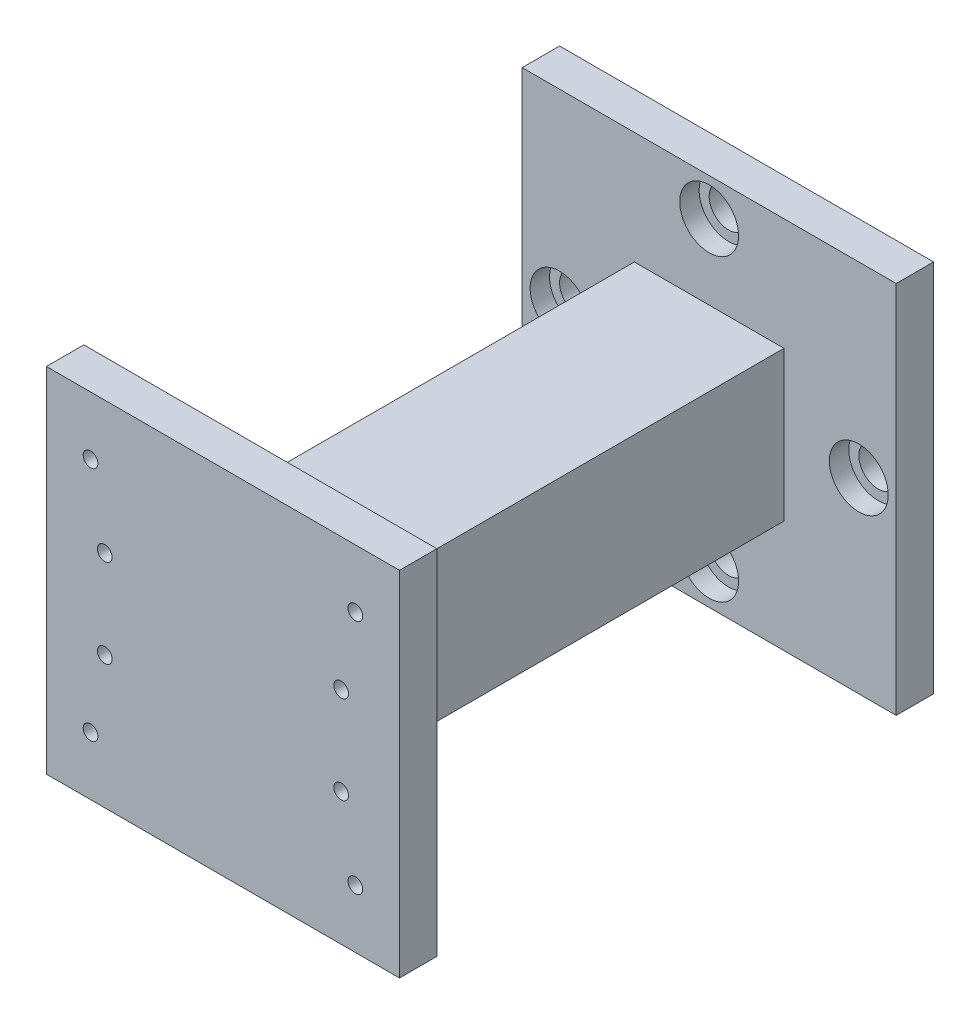
ISO-10303-21;
HEADER;
FILE_DESCRIPTION(('STEP AP214'),'2;1');
FILE_NAME('part.step','',(''),(''),'','','');
FILE_SCHEMA(('AUTOMOTIVE_DESIGN { 1 0 10303 214 1 1 1 1 }'));
ENDSEC;
DATA;
#1=APPLICATION_CONTEXT('core data for automotive mechanical design processes');
#2=APPLICATION_PROTOCOL_DEFINITION('international standard','automotive_design',2000,#1);
#3=PRODUCT_CONTEXT('',#1,'mechanical');
#4=PRODUCT('Part','Part','',(#3));
#5=PRODUCT_RELATED_PRODUCT_CATEGORY('part','',(#4));
#6=PRODUCT_DEFINITION_FORMATION('','',#4);
#7=PRODUCT_DEFINITION_CONTEXT('part definition',#1,'design');
#8=PRODUCT_DEFINITION('design','',#6,#7);
#9=PRODUCT_DEFINITION_SHAPE('','',#8);
#10=(LENGTH_UNIT() NAMED_UNIT(*) SI_UNIT(.MILLI.,.METRE.));
#11=(NAMED_UNIT(*) PLANE_ANGLE_UNIT() SI_UNIT($,.RADIAN.));
#12=(NAMED_UNIT(*) SI_UNIT($,.STERADIAN.) SOLID_ANGLE_UNIT());
#13=UNCERTAINTY_MEASURE_WITH_UNIT(LENGTH_MEASURE(1.E-05),#10,'distance_accuracy_value','');
#14=(GEOMETRIC_REPRESENTATION_CONTEXT(3) GLOBAL_UNCERTAINTY_ASSIGNED_CONTEXT((#13)) GLOBAL_UNIT_ASSIGNED_CONTEXT((#10,
#11,#12)) REPRESENTATION_CONTEXT('',''));
#15=CARTESIAN_POINT('',(0.,0.,0.));
#16=DIRECTION('',(0.,0.,1.));
#17=DIRECTION('',(1.,0.,0.));
#18=AXIS2_PLACEMENT_3D('',#15,#16,#17);
#19=CARTESIAN_POINT('',(0.,63.5,6.35));
#20=DIRECTION('',(1.,0.,0.));
#21=DIRECTION('',(0.,0.,-1.));
#22=AXIS2_PLACEMENT_3D('',#19,#20,#21);
#23=PLANE('',#22);
#24=DIRECTION('',(0.,-1.,0.));
#25=VECTOR('',#24,1.);
#26=CARTESIAN_POINT('',(0.,63.5,0.));
#27=LINE('',#26,#25);
#28=CARTESIAN_POINT('',(0.,63.5,0.));
#29=VERTEX_POINT('',#28);
#30=CARTESIAN_POINT('',(0.,0.,0.));
#31=VERTEX_POINT('',#30);
#32=EDGE_CURVE('E209',#29,#31,#27,.T.);
#33=ORIENTED_EDGE('',*,*,#32,.T.);
#34=DIRECTION('',(0.,0.,-1.));
#35=VECTOR('',#34,1.);
#36=CARTESIAN_POINT('',(0.,0.,6.35));
#37=LINE('',#36,#35);
#38=CARTESIAN_POINT('',(0.,0.,6.35));
#39=VERTEX_POINT('',#38);
#40=EDGE_CURVE('E11',#39,#31,#37,.T.);
#41=ORIENTED_EDGE('',*,*,#40,.F.);
#42=DIRECTION('',(0.,-1.,0.));
#43=VECTOR('',#42,1.);
#44=CARTESIAN_POINT('',(0.,63.5,6.35));
#45=LINE('',#44,#43);
#46=CARTESIAN_POINT('',(0.,63.5,6.35));
#47=VERTEX_POINT('',#46);
#48=EDGE_CURVE('E210',#47,#39,#45,.T.);
#49=ORIENTED_EDGE('',*,*,#48,.F.);
#50=DIRECTION('',(0.,0.,-1.));
#51=VECTOR('',#50,1.);
#52=CARTESIAN_POINT('',(0.,63.5,6.35));
#53=LINE('',#52,#51);
#54=EDGE_CURVE('E224',#47,#29,#53,.T.);
#55=ORIENTED_EDGE('',*,*,#54,.T.);
#56=EDGE_LOOP('',(#33,#41,#49,#55));
#57=FACE_BOUND('',#56,.T.);
#58=ADVANCED_FACE('F43',(#57),#23,.F.);
#59=CARTESIAN_POINT('',(0.,0.,6.35));
#60=DIRECTION('',(0.,1.,0.));
#61=DIRECTION('',(0.,0.,1.));
#62=AXIS2_PLACEMENT_3D('',#59,#60,#61);
#63=PLANE('',#62);
#64=DIRECTION('',(1.,0.,0.));
#65=VECTOR('',#64,1.);
#66=CARTESIAN_POINT('',(0.,0.,0.));
#67=LINE('',#66,#65);
#68=CARTESIAN_POINT('',(63.5,0.,0.));
#69=VERTEX_POINT('',#68);
#70=EDGE_CURVE('E228',#31,#69,#67,.T.);
#71=ORIENTED_EDGE('',*,*,#70,.T.);
#72=DIRECTION('',(0.,0.,-1.));
#73=VECTOR('',#72,1.);
#74=CARTESIAN_POINT('',(63.5,0.,6.35));
#75=LINE('',#74,#73);
#76=CARTESIAN_POINT('',(63.5,0.,6.35));
#77=VERTEX_POINT('',#76);
#78=EDGE_CURVE('E52',#77,#69,#75,.T.);
#79=ORIENTED_EDGE('',*,*,#78,.F.);
#80=DIRECTION('',(1.,0.,0.));
#81=VECTOR('',#80,1.);
#82=CARTESIAN_POINT('',(0.,0.,6.35));
#83=LINE('',#82,#81);
#84=EDGE_CURVE('E214',#39,#77,#83,.T.);
#85=ORIENTED_EDGE('',*,*,#84,.F.);
#86=ORIENTED_EDGE('',*,*,#40,.T.);
#87=EDGE_LOOP('',(#71,#79,#85,#86));
#88=FACE_BOUND('',#87,.T.);
#89=ADVANCED_FACE('F409',(#88),#63,.F.);
#90=CARTESIAN_POINT('',(63.5,0.,6.35));
#91=DIRECTION('',(-1.,0.,0.));
#92=DIRECTION('',(0.,0.,1.));
#93=AXIS2_PLACEMENT_3D('',#90,#91,#92);
#94=PLANE('',#93);
#95=DIRECTION('',(0.,1.,0.));
#96=VECTOR('',#95,1.);
#97=CARTESIAN_POINT('',(63.5,0.,0.));
#98=LINE('',#97,#96);
#99=CARTESIAN_POINT('',(63.5,63.5,0.));
#100=VERTEX_POINT('',#99);
#101=EDGE_CURVE('E231',#69,#100,#98,.T.);
#102=ORIENTED_EDGE('',*,*,#101,.T.);
#103=DIRECTION('',(0.,0.,-1.));
#104=VECTOR('',#103,1.);
#105=CARTESIAN_POINT('',(63.5,63.5,6.35));
#106=LINE('',#105,#104);
#107=CARTESIAN_POINT('',(63.5,63.5,6.35));
#108=VERTEX_POINT('',#107);
#109=EDGE_CURVE('E239',#108,#100,#106,.T.);
#110=ORIENTED_EDGE('',*,*,#109,.F.);
#111=DIRECTION('',(0.,1.,0.));
#112=VECTOR('',#111,1.);
#113=CARTESIAN_POINT('',(63.5,0.,6.35));
#114=LINE('',#113,#112);
#115=EDGE_CURVE('E218',#77,#108,#114,.T.);
#116=ORIENTED_EDGE('',*,*,#115,.F.);
#117=ORIENTED_EDGE('',*,*,#78,.T.);
#118=EDGE_LOOP('',(#102,#110,#116,#117));
#119=FACE_BOUND('',#118,.T.);
#120=ADVANCED_FACE('F414',(#119),#94,.F.);
#121=CARTESIAN_POINT('',(63.5,63.5,6.35));
#122=DIRECTION('',(0.,-1.,0.));
#123=DIRECTION('',(0.,0.,-1.));
#124=AXIS2_PLACEMENT_3D('',#121,#122,#123);
#125=PLANE('',#124);
#126=DIRECTION('',(-1.,0.,0.));
#127=VECTOR('',#126,1.);
#128=CARTESIAN_POINT('',(63.5,63.5,0.));
#129=LINE('',#128,#127);
#130=EDGE_CURVE('E215',#100,#29,#129,.T.);
#131=ORIENTED_EDGE('',*,*,#130,.T.);
#132=ORIENTED_EDGE('',*,*,#54,.F.);
#133=DIRECTION('',(-1.,0.,0.));
#134=VECTOR('',#133,1.);
#135=CARTESIAN_POINT('',(63.5,63.5,6.35));
#136=LINE('',#135,#134);
#137=EDGE_CURVE('E221',#108,#47,#136,.T.);
#138=ORIENTED_EDGE('',*,*,#137,.F.);
#139=ORIENTED_EDGE('',*,*,#109,.T.);
#140=EDGE_LOOP('',(#131,#132,#138,#139));
#141=FACE_BOUND('',#140,.T.);
#142=ADVANCED_FACE('F431',(#141),#125,.F.);
#143=CARTESIAN_POINT('',(0.,0.,6.35));
#144=DIRECTION('',(0.,0.,1.));
#145=DIRECTION('',(1.,0.,0.));
#146=AXIS2_PLACEMENT_3D('',#143,#144,#145);
#147=PLANE('',#146);
#148=CARTESIAN_POINT('',(57.15,31.75,6.35));
#149=DIRECTION('',(0.,0.,1.));
#150=DIRECTION('',(1.,0.,0.));
#151=AXIS2_PLACEMENT_3D('',#148,#149,#150);
#152=CIRCLE('',#151,5.);
#153=CARTESIAN_POINT('',(62.15,31.75,6.35));
#154=VERTEX_POINT('',#153);
#155=EDGE_CURVE('E273',#154,#154,#152,.T.);
#156=ORIENTED_EDGE('',*,*,#155,.F.);
#157=EDGE_LOOP('',(#156));
#158=FACE_BOUND('',#157,.T.);
#159=CARTESIAN_POINT('',(31.75,6.35,6.35));
#160=DIRECTION('',(0.,0.,1.));
#161=DIRECTION('',(1.,0.,0.));
#162=AXIS2_PLACEMENT_3D('',#159,#160,#161);
#163=CIRCLE('',#162,5.);
#164=CARTESIAN_POINT('',(36.75,6.35,6.35));
#165=VERTEX_POINT('',#164);
#166=EDGE_CURVE('E267',#165,#165,#163,.T.);
#167=ORIENTED_EDGE('',*,*,#166,.F.);
#168=EDGE_LOOP('',(#167));
#169=FACE_BOUND('',#168,.T.);
#170=CARTESIAN_POINT('',(31.75,57.15,6.35));
#171=DIRECTION('',(0.,0.,1.));
#172=DIRECTION('',(1.,0.,0.));
#173=AXIS2_PLACEMENT_3D('',#170,#171,#172);
#174=CIRCLE('',#173,5.);
#175=CARTESIAN_POINT('',(36.75,57.15,6.35));
#176=VERTEX_POINT('',#175);
#177=EDGE_CURVE('E261',#176,#176,#174,.T.);
#178=ORIENTED_EDGE('',*,*,#177,.F.);
#179=EDGE_LOOP('',(#178));
#180=FACE_BOUND('',#179,.T.);
#181=CARTESIAN_POINT('',(6.35,31.75,6.35));
#182=DIRECTION('',(0.,0.,1.));
#183=DIRECTION('',(1.,0.,0.));
#184=AXIS2_PLACEMENT_3D('',#181,#182,#183);
#185=CIRCLE('',#184,5.);
#186=CARTESIAN_POINT('',(11.35,31.75,6.35));
#187=VERTEX_POINT('',#186);
#188=EDGE_CURVE('E255',#187,#187,#185,.T.);
#189=ORIENTED_EDGE('',*,*,#188,.F.);
#190=EDGE_LOOP('',(#189));
#191=FACE_BOUND('',#190,.T.);
#192=DIRECTION('',(-1.,0.,0.));
#193=VECTOR('',#192,1.);
#194=CARTESIAN_POINT('',(44.45,44.45,6.35));
#195=LINE('',#194,#193);
#196=CARTESIAN_POINT('',(44.45,44.45,6.35));
#197=VERTEX_POINT('',#196);
#198=CARTESIAN_POINT('',(19.05,44.45,6.35));
#199=VERTEX_POINT('',#198);
#200=EDGE_CURVE('E60',#197,#199,#195,.T.);
#201=ORIENTED_EDGE('',*,*,#200,.F.);
#202=DIRECTION('',(0.,1.,0.));
#203=VECTOR('',#202,1.);
#204=CARTESIAN_POINT('',(44.45,19.05,6.35));
#205=LINE('',#204,#203);
#206=CARTESIAN_POINT('',(44.45,19.05,6.35));
#207=VERTEX_POINT('',#206);
#208=EDGE_CURVE('E64',#207,#197,#205,.T.);
#209=ORIENTED_EDGE('',*,*,#208,.F.);
#210=DIRECTION('',(1.,0.,0.));
#211=VECTOR('',#210,1.);
#212=CARTESIAN_POINT('',(19.05,19.05,6.35));
#213=LINE('',#212,#211);
#214=CARTESIAN_POINT('',(19.05,19.05,6.35));
#215=VERTEX_POINT('',#214);
#216=EDGE_CURVE('E189',#215,#207,#213,.T.);
#217=ORIENTED_EDGE('',*,*,#216,.F.);
#218=DIRECTION('',(0.,-1.,0.));
#219=VECTOR('',#218,1.);
#220=CARTESIAN_POINT('',(19.05,44.45,6.35));
#221=LINE('',#220,#219);
#222=EDGE_CURVE('E163',#199,#215,#221,.T.);
#223=ORIENTED_EDGE('',*,*,#222,.F.);
#224=EDGE_LOOP('',(#201,#209,#217,#223));
#225=FACE_BOUND('',#224,.T.);
#226=ORIENTED_EDGE('',*,*,#48,.T.);
#227=ORIENTED_EDGE('',*,*,#84,.T.);
#228=ORIENTED_EDGE('',*,*,#115,.T.);
#229=ORIENTED_EDGE('',*,*,#137,.T.);
#230=EDGE_LOOP('',(#226,#227,#228,#229));
#231=FACE_BOUND('',#230,.T.);
#232=ADVANCED_FACE('F427',(#158,#169,#180,#191,#225,#231),#147,.T.);
#233=CARTESIAN_POINT('',(0.,0.,0.));
#234=DIRECTION('',(0.,0.,1.));
#235=DIRECTION('',(1.,0.,0.));
#236=AXIS2_PLACEMENT_3D('',#233,#234,#235);
#237=PLANE('',#236);
#238=CARTESIAN_POINT('',(57.15,31.75,0.));
#239=DIRECTION('',(0.,0.,1.));
#240=DIRECTION('',(1.,0.,0.));
#241=AXIS2_PLACEMENT_3D('',#238,#239,#240);
#242=CIRCLE('',#241,3.3);
#243=CARTESIAN_POINT('',(60.45,31.75,0.));
#244=VERTEX_POINT('',#243);
#245=EDGE_CURVE('E263',#244,#244,#242,.T.);
#246=ORIENTED_EDGE('',*,*,#245,.T.);
#247=EDGE_LOOP('',(#246));
#248=FACE_BOUND('',#247,.T.);
#249=CARTESIAN_POINT('',(31.75,6.35,0.));
#250=DIRECTION('',(0.,0.,1.));
#251=DIRECTION('',(1.,0.,0.));
#252=AXIS2_PLACEMENT_3D('',#249,#250,#251);
#253=CIRCLE('',#252,3.3);
#254=CARTESIAN_POINT('',(35.05,6.35,0.));
#255=VERTEX_POINT('',#254);
#256=EDGE_CURVE('E257',#255,#255,#253,.T.);
#257=ORIENTED_EDGE('',*,*,#256,.T.);
#258=EDGE_LOOP('',(#257));
#259=FACE_BOUND('',#258,.T.);
#260=CARTESIAN_POINT('',(31.75,57.15,0.));
#261=DIRECTION('',(0.,0.,1.));
#262=DIRECTION('',(1.,0.,0.));
#263=AXIS2_PLACEMENT_3D('',#260,#261,#262);
#264=CIRCLE('',#263,3.3);
#265=CARTESIAN_POINT('',(35.05,57.15,0.));
#266=VERTEX_POINT('',#265);
#267=EDGE_CURVE('E251',#266,#266,#264,.T.);
#268=ORIENTED_EDGE('',*,*,#267,.T.);
#269=EDGE_LOOP('',(#268));
#270=FACE_BOUND('',#269,.T.);
#271=CARTESIAN_POINT('',(6.35,31.75,0.));
#272=DIRECTION('',(0.,0.,1.));
#273=DIRECTION('',(1.,0.,0.));
#274=AXIS2_PLACEMENT_3D('',#271,#272,#273);
#275=CIRCLE('',#274,3.3);
#276=CARTESIAN_POINT('',(9.65,31.75,0.));
#277=VERTEX_POINT('',#276);
#278=EDGE_CURVE('E246',#277,#277,#275,.T.);
#279=ORIENTED_EDGE('',*,*,#278,.T.);
#280=EDGE_LOOP('',(#279));
#281=FACE_BOUND('',#280,.T.);
#282=ORIENTED_EDGE('',*,*,#32,.F.);
#283=ORIENTED_EDGE('',*,*,#130,.F.);
#284=ORIENTED_EDGE('',*,*,#101,.F.);
#285=ORIENTED_EDGE('',*,*,#70,.F.);
#286=EDGE_LOOP('',(#282,#283,#284,#285));
#287=FACE_BOUND('',#286,.T.);
#288=ADVANCED_FACE('F422',(#248,#259,#270,#281,#287),#237,.F.);
#289=CARTESIAN_POINT('',(44.45,44.45,82.55));
#290=DIRECTION('',(0.,-1.,0.));
#291=DIRECTION('',(0.,0.,-1.));
#292=AXIS2_PLACEMENT_3D('',#289,#290,#291);
#293=PLANE('',#292);
#294=ORIENTED_EDGE('',*,*,#200,.T.);
#295=DIRECTION('',(0.,0.,-1.));
#296=VECTOR('',#295,1.);
#297=CARTESIAN_POINT('',(19.05,44.45,82.55));
#298=LINE('',#297,#296);
#299=CARTESIAN_POINT('',(19.05,44.45,82.55));
#300=VERTEX_POINT('',#299);
#301=EDGE_CURVE('E205',#300,#199,#298,.T.);
#302=ORIENTED_EDGE('',*,*,#301,.F.);
#303=DIRECTION('',(-1.,0.,0.));
#304=VECTOR('',#303,1.);
#305=CARTESIAN_POINT('',(44.45,44.45,82.55));
#306=LINE('',#305,#304);
#307=CARTESIAN_POINT('',(44.45,44.45,82.55));
#308=VERTEX_POINT('',#307);
#309=EDGE_CURVE('E169',#308,#300,#306,.T.);
#310=ORIENTED_EDGE('',*,*,#309,.F.);
#311=DIRECTION('',(0.,0.,-1.));
#312=VECTOR('',#311,1.);
#313=CARTESIAN_POINT('',(44.45,44.45,82.55));
#314=LINE('',#313,#312);
#315=EDGE_CURVE('E184',#308,#197,#314,.T.);
#316=ORIENTED_EDGE('',*,*,#315,.T.);
#317=EDGE_LOOP('',(#294,#302,#310,#316));
#318=FACE_BOUND('',#317,.T.);
#319=ADVANCED_FACE('F442',(#318),#293,.F.);
#320=CARTESIAN_POINT('',(19.05,44.45,82.55));
#321=DIRECTION('',(1.,0.,0.));
#322=DIRECTION('',(0.,1.,0.));
#323=AXIS2_PLACEMENT_3D('',#320,#321,#322);
#324=PLANE('',#323);
#325=ORIENTED_EDGE('',*,*,#222,.T.);
#326=DIRECTION('',(0.,0.,-1.));
#327=VECTOR('',#326,1.);
#328=CARTESIAN_POINT('',(19.05,19.05,82.55));
#329=LINE('',#328,#327);
#330=CARTESIAN_POINT('',(19.05,19.05,82.55));
#331=VERTEX_POINT('',#330);
#332=EDGE_CURVE('E201',#331,#215,#329,.T.);
#333=ORIENTED_EDGE('',*,*,#332,.F.);
#334=DIRECTION('',(0.,-1.,0.));
#335=VECTOR('',#334,1.);
#336=CARTESIAN_POINT('',(19.05,44.45,82.55));
#337=LINE('',#336,#335);
#338=EDGE_CURVE('E173',#300,#331,#337,.T.);
#339=ORIENTED_EDGE('',*,*,#338,.F.);
#340=ORIENTED_EDGE('',*,*,#301,.T.);
#341=EDGE_LOOP('',(#325,#333,#339,#340));
#342=FACE_BOUND('',#341,.T.);
#343=ADVANCED_FACE('F449',(#342),#324,.F.);
#344=CARTESIAN_POINT('',(19.05,19.05,82.55));
#345=DIRECTION('',(0.,1.,0.));
#346=DIRECTION('',(0.,0.,1.));
#347=AXIS2_PLACEMENT_3D('',#344,#345,#346);
#348=PLANE('',#347);
#349=ORIENTED_EDGE('',*,*,#216,.T.);
#350=DIRECTION('',(0.,0.,-1.));
#351=VECTOR('',#350,1.);
#352=CARTESIAN_POINT('',(44.45,19.05,82.55));
#353=LINE('',#352,#351);
#354=CARTESIAN_POINT('',(44.45,19.05,82.55));
#355=VERTEX_POINT('',#354);
#356=EDGE_CURVE('E197',#355,#207,#353,.T.);
#357=ORIENTED_EDGE('',*,*,#356,.F.);
#358=DIRECTION('',(1.,0.,0.));
#359=VECTOR('',#358,1.);
#360=CARTESIAN_POINT('',(19.05,19.05,82.55));
#361=LINE('',#360,#359);
#362=EDGE_CURVE('E177',#331,#355,#361,.T.);
#363=ORIENTED_EDGE('',*,*,#362,.F.);
#364=ORIENTED_EDGE('',*,*,#332,.T.);
#365=EDGE_LOOP('',(#349,#357,#363,#364));
#366=FACE_BOUND('',#365,.T.);
#367=ADVANCED_FACE('F453',(#366),#348,.F.);
#368=CARTESIAN_POINT('',(44.45,19.05,82.55));
#369=DIRECTION('',(-1.,0.,0.));
#370=DIRECTION('',(0.,0.,1.));
#371=AXIS2_PLACEMENT_3D('',#368,#369,#370);
#372=PLANE('',#371);
#373=ORIENTED_EDGE('',*,*,#208,.T.);
#374=ORIENTED_EDGE('',*,*,#315,.F.);
#375=DIRECTION('',(0.,1.,0.));
#376=VECTOR('',#375,1.);
#377=CARTESIAN_POINT('',(44.45,19.05,82.55));
#378=LINE('',#377,#376);
#379=EDGE_CURVE('E181',#355,#308,#378,.T.);
#380=ORIENTED_EDGE('',*,*,#379,.F.);
#381=ORIENTED_EDGE('',*,*,#356,.T.);
#382=EDGE_LOOP('',(#373,#374,#380,#381));
#383=FACE_BOUND('',#382,.T.);
#384=ADVANCED_FACE('F457',(#383),#372,.F.);
#385=CARTESIAN_POINT('',(1.778,1.77799999999999,88.9));
#386=DIRECTION('',(1.,0.,0.));
#387=DIRECTION('',(0.,1.,0.));
#388=AXIS2_PLACEMENT_3D('',#385,#386,#387);
#389=PLANE('',#388);
#390=DIRECTION('',(0.,-1.,0.));
#391=VECTOR('',#390,1.);
#392=CARTESIAN_POINT('',(1.778,1.77799999999999,82.55));
#393=LINE('',#392,#391);
#394=CARTESIAN_POINT('',(1.778,61.722,82.55));
#395=VERTEX_POINT('',#394);
#396=CARTESIAN_POINT('',(1.778,1.77799999999999,82.55));
#397=VERTEX_POINT('',#396);
#398=EDGE_CURVE('E158',#395,#397,#393,.T.);
#399=ORIENTED_EDGE('',*,*,#398,.T.);
#400=DIRECTION('',(0.,0.,-1.));
#401=VECTOR('',#400,1.);
#402=CARTESIAN_POINT('',(1.778,1.77799999999999,88.9));
#403=LINE('',#402,#401);
#404=CARTESIAN_POINT('',(1.778,1.77799999999999,88.9));
#405=VERTEX_POINT('',#404);
#406=EDGE_CURVE('E136',#405,#397,#403,.T.);
#407=ORIENTED_EDGE('',*,*,#406,.F.);
#408=DIRECTION('',(0.,-1.,0.));
#409=VECTOR('',#408,1.);
#410=CARTESIAN_POINT('',(1.778,1.77799999999999,88.9));
#411=LINE('',#410,#409);
#412=CARTESIAN_POINT('',(1.778,61.722,88.9));
#413=VERTEX_POINT('',#412);
#414=EDGE_CURVE('E144',#413,#405,#411,.T.);
#415=ORIENTED_EDGE('',*,*,#414,.F.);
#416=DIRECTION('',(0.,0.,-1.));
#417=VECTOR('',#416,1.);
#418=CARTESIAN_POINT('',(1.778,61.722,88.9));
#419=LINE('',#418,#417);
#420=EDGE_CURVE('E377',#413,#395,#419,.T.);
#421=ORIENTED_EDGE('',*,*,#420,.T.);
#422=EDGE_LOOP('',(#399,#407,#415,#421));
#423=FACE_BOUND('',#422,.T.);
#424=ADVANCED_FACE('F156',(#423),#389,.F.);
#425=CARTESIAN_POINT('',(61.722,1.778,88.9));
#426=DIRECTION('',(0.,1.,0.));
#427=DIRECTION('',(-1.,0.,0.));
#428=AXIS2_PLACEMENT_3D('',#425,#426,#427);
#429=PLANE('',#428);
#430=DIRECTION('',(1.,0.,0.));
#431=VECTOR('',#430,1.);
#432=CARTESIAN_POINT('',(61.722,1.778,82.55));
#433=LINE('',#432,#431);
#434=CARTESIAN_POINT('',(61.722,1.778,82.55));
#435=VERTEX_POINT('',#434);
#436=EDGE_CURVE('E380',#397,#435,#433,.T.);
#437=ORIENTED_EDGE('',*,*,#436,.T.);
#438=DIRECTION('',(0.,0.,-1.));
#439=VECTOR('',#438,1.);
#440=CARTESIAN_POINT('',(61.722,1.778,88.9));
#441=LINE('',#440,#439);
#442=CARTESIAN_POINT('',(61.722,1.778,88.9));
#443=VERTEX_POINT('',#442);
#444=EDGE_CURVE('E139',#443,#435,#441,.T.);
#445=ORIENTED_EDGE('',*,*,#444,.F.);
#446=DIRECTION('',(1.,0.,0.));
#447=VECTOR('',#446,1.);
#448=CARTESIAN_POINT('',(61.722,1.778,88.9));
#449=LINE('',#448,#447);
#450=EDGE_CURVE('E132',#405,#443,#449,.T.);
#451=ORIENTED_EDGE('',*,*,#450,.F.);
#452=ORIENTED_EDGE('',*,*,#406,.T.);
#453=EDGE_LOOP('',(#437,#445,#451,#452));
#454=FACE_BOUND('',#453,.T.);
#455=ADVANCED_FACE('F134',(#454),#429,.F.);
#456=CARTESIAN_POINT('',(61.722,61.722,88.9));
#457=DIRECTION('',(-1.,0.,0.));
#458=DIRECTION('',(0.,0.,1.));
#459=AXIS2_PLACEMENT_3D('',#456,#457,#458);
#460=PLANE('',#459);
#461=DIRECTION('',(0.,1.,0.));
#462=VECTOR('',#461,1.);
#463=CARTESIAN_POINT('',(61.722,61.722,82.55));
#464=LINE('',#463,#462);
#465=CARTESIAN_POINT('',(61.722,61.722,82.55));
#466=VERTEX_POINT('',#465);
#467=EDGE_CURVE('E383',#435,#466,#464,.T.);
#468=ORIENTED_EDGE('',*,*,#467,.T.);
#469=DIRECTION('',(0.,0.,-1.));
#470=VECTOR('',#469,1.);
#471=CARTESIAN_POINT('',(61.722,61.722,88.9));
#472=LINE('',#471,#470);
#473=CARTESIAN_POINT('',(61.722,61.722,88.9));
#474=VERTEX_POINT('',#473);
#475=EDGE_CURVE('E165',#474,#466,#472,.T.);
#476=ORIENTED_EDGE('',*,*,#475,.F.);
#477=DIRECTION('',(0.,1.,0.));
#478=VECTOR('',#477,1.);
#479=CARTESIAN_POINT('',(61.722,61.722,88.9));
#480=LINE('',#479,#478);
#481=EDGE_CURVE('E143',#443,#474,#480,.T.);
#482=ORIENTED_EDGE('',*,*,#481,.F.);
#483=ORIENTED_EDGE('',*,*,#444,.T.);
#484=EDGE_LOOP('',(#468,#476,#482,#483));
#485=FACE_BOUND('',#484,.T.);
#486=ADVANCED_FACE('F399',(#485),#460,.F.);
#487=CARTESIAN_POINT('',(1.778,61.722,88.9));
#488=DIRECTION('',(0.,-1.,0.));
#489=DIRECTION('',(0.,0.,-1.));
#490=AXIS2_PLACEMENT_3D('',#487,#488,#489);
#491=PLANE('',#490);
#492=DIRECTION('',(-1.,0.,0.));
#493=VECTOR('',#492,1.);
#494=CARTESIAN_POINT('',(1.778,61.722,82.55));
#495=LINE('',#494,#493);
#496=EDGE_CURVE('E154',#466,#395,#495,.T.);
#497=ORIENTED_EDGE('',*,*,#496,.T.);
#498=ORIENTED_EDGE('',*,*,#420,.F.);
#499=DIRECTION('',(-1.,0.,0.));
#500=VECTOR('',#499,1.);
#501=CARTESIAN_POINT('',(1.778,61.722,88.9));
#502=LINE('',#501,#500);
#503=EDGE_CURVE('E149',#474,#413,#502,.T.);
#504=ORIENTED_EDGE('',*,*,#503,.F.);
#505=ORIENTED_EDGE('',*,*,#475,.T.);
#506=EDGE_LOOP('',(#497,#498,#504,#505));
#507=FACE_BOUND('',#506,.T.);
#508=ADVANCED_FACE('F394',(#507),#491,.F.);
#509=CARTESIAN_POINT('',(0.,0.,88.9));
#510=DIRECTION('',(0.,0.,-1.));
#511=DIRECTION('',(-1.,0.,0.));
#512=AXIS2_PLACEMENT_3D('',#509,#510,#511);
#513=PLANE('',#512);
#514=CARTESIAN_POINT('',(9.271,51.816,88.9));
#515=DIRECTION('',(0.,0.,1.));
#516=DIRECTION('',(1.,0.,0.));
#517=AXIS2_PLACEMENT_3D('',#514,#515,#516);
#518=CIRCLE('',#517,1.25);
#519=CARTESIAN_POINT('',(10.521,51.816,88.9));
#520=VERTEX_POINT('',#519);
#521=EDGE_CURVE('E311',#520,#520,#518,.T.);
#522=ORIENTED_EDGE('',*,*,#521,.F.);
#523=EDGE_LOOP('',(#522));
#524=FACE_BOUND('',#523,.T.);
#525=CARTESIAN_POINT('',(9.271,11.684,88.9));
#526=DIRECTION('',(0.,0.,1.));
#527=DIRECTION('',(1.,0.,0.));
#528=AXIS2_PLACEMENT_3D('',#525,#526,#527);
#529=CIRCLE('',#528,1.25);
#530=CARTESIAN_POINT('',(10.521,11.684,88.9));
#531=VERTEX_POINT('',#530);
#532=EDGE_CURVE('E298',#531,#531,#529,.T.);
#533=ORIENTED_EDGE('',*,*,#532,.F.);
#534=EDGE_LOOP('',(#533));
#535=FACE_BOUND('',#534,.T.);
#536=CARTESIAN_POINT('',(54.229,11.684,88.9));
#537=DIRECTION('',(0.,0.,1.));
#538=DIRECTION('',(1.,0.,0.));
#539=AXIS2_PLACEMENT_3D('',#536,#537,#538);
#540=CIRCLE('',#539,1.25);
#541=CARTESIAN_POINT('',(55.479,11.684,88.9));
#542=VERTEX_POINT('',#541);
#543=EDGE_CURVE('E294',#542,#542,#540,.T.);
#544=ORIENTED_EDGE('',*,*,#543,.F.);
#545=EDGE_LOOP('',(#544));
#546=FACE_BOUND('',#545,.T.);
#547=CARTESIAN_POINT('',(54.229,51.816,88.9));
#548=DIRECTION('',(0.,0.,1.));
#549=DIRECTION('',(1.,0.,0.));
#550=AXIS2_PLACEMENT_3D('',#547,#548,#549);
#551=CIRCLE('',#550,1.25);
#552=CARTESIAN_POINT('',(55.479,51.816,88.9));
#553=VERTEX_POINT('',#552);
#554=EDGE_CURVE('E290',#553,#553,#551,.T.);
#555=ORIENTED_EDGE('',*,*,#554,.F.);
#556=EDGE_LOOP('',(#555));
#557=FACE_BOUND('',#556,.T.);
#558=CARTESIAN_POINT('',(11.684,39.243,88.9));
#559=DIRECTION('',(0.,0.,1.));
#560=DIRECTION('',(1.,0.,0.));
#561=AXIS2_PLACEMENT_3D('',#558,#559,#560);
#562=CIRCLE('',#561,1.25);
#563=CARTESIAN_POINT('',(12.934,39.243,88.9));
#564=VERTEX_POINT('',#563);
#565=EDGE_CURVE('E285',#564,#564,#562,.T.);
#566=ORIENTED_EDGE('',*,*,#565,.F.);
#567=EDGE_LOOP('',(#566));
#568=FACE_BOUND('',#567,.T.);
#569=CARTESIAN_POINT('',(11.684,24.257,88.9));
#570=DIRECTION('',(0.,0.,1.));
#571=DIRECTION('',(1.,0.,0.));
#572=AXIS2_PLACEMENT_3D('',#569,#570,#571);
#573=CIRCLE('',#572,1.25);
#574=CARTESIAN_POINT('',(12.934,24.257,88.9));
#575=VERTEX_POINT('',#574);
#576=EDGE_CURVE('E284',#575,#575,#573,.T.);
#577=ORIENTED_EDGE('',*,*,#576,.F.);
#578=EDGE_LOOP('',(#577));
#579=FACE_BOUND('',#578,.T.);
#580=CARTESIAN_POINT('',(51.816,39.243,88.9));
#581=DIRECTION('',(0.,0.,1.));
#582=DIRECTION('',(1.,0.,0.));
#583=AXIS2_PLACEMENT_3D('',#580,#581,#582);
#584=CIRCLE('',#583,1.25);
#585=CARTESIAN_POINT('',(53.066,39.243,88.9));
#586=VERTEX_POINT('',#585);
#587=EDGE_CURVE('E279',#586,#586,#584,.T.);
#588=ORIENTED_EDGE('',*,*,#587,.F.);
#589=EDGE_LOOP('',(#588));
#590=FACE_BOUND('',#589,.T.);
#591=CARTESIAN_POINT('',(51.816,24.257,88.9));
#592=DIRECTION('',(0.,0.,1.));
#593=DIRECTION('',(1.,0.,0.));
#594=AXIS2_PLACEMENT_3D('',#591,#592,#593);
#595=CIRCLE('',#594,1.25);
#596=CARTESIAN_POINT('',(53.066,24.257,88.9));
#597=VERTEX_POINT('',#596);
#598=EDGE_CURVE('E274',#597,#597,#595,.T.);
#599=ORIENTED_EDGE('',*,*,#598,.F.);
#600=EDGE_LOOP('',(#599));
#601=FACE_BOUND('',#600,.T.);
#602=ORIENTED_EDGE('',*,*,#414,.T.);
#603=ORIENTED_EDGE('',*,*,#450,.T.);
#604=ORIENTED_EDGE('',*,*,#481,.T.);
#605=ORIENTED_EDGE('',*,*,#503,.T.);
#606=EDGE_LOOP('',(#602,#603,#604,#605));
#607=FACE_BOUND('',#606,.T.);
#608=ADVANCED_FACE('F147',(#524,#535,#546,#557,#568,#579,#590,#601,#607),#513,.F.);
#609=CARTESIAN_POINT('',(0.,0.,82.55));
#610=DIRECTION('',(0.,0.,-1.));
#611=DIRECTION('',(-1.,0.,0.));
#612=AXIS2_PLACEMENT_3D('',#609,#610,#611);
#613=PLANE('',#612);
#614=CARTESIAN_POINT('',(9.271,51.816,82.55));
#615=DIRECTION('',(0.,0.,-1.));
#616=DIRECTION('',(-1.,0.,0.));
#617=AXIS2_PLACEMENT_3D('',#614,#615,#616);
#618=CIRCLE('',#617,1.25);
#619=CARTESIAN_POINT('',(8.021,51.816,82.55));
#620=VERTEX_POINT('',#619);
#621=EDGE_CURVE('E46',#620,#620,#618,.T.);
#622=ORIENTED_EDGE('',*,*,#621,.F.);
#623=EDGE_LOOP('',(#622));
#624=FACE_BOUND('',#623,.T.);
#625=CARTESIAN_POINT('',(9.271,11.684,82.55));
#626=DIRECTION('',(0.,0.,-1.));
#627=DIRECTION('',(-1.,0.,0.));
#628=AXIS2_PLACEMENT_3D('',#625,#626,#627);
#629=CIRCLE('',#628,1.25);
#630=CARTESIAN_POINT('',(8.021,11.684,82.55));
#631=VERTEX_POINT('',#630);
#632=EDGE_CURVE('E295',#631,#631,#629,.T.);
#633=ORIENTED_EDGE('',*,*,#632,.F.);
#634=EDGE_LOOP('',(#633));
#635=FACE_BOUND('',#634,.T.);
#636=CARTESIAN_POINT('',(54.229,11.684,82.55));
#637=DIRECTION('',(0.,0.,-1.));
#638=DIRECTION('',(-1.,0.,0.));
#639=AXIS2_PLACEMENT_3D('',#636,#637,#638);
#640=CIRCLE('',#639,1.25);
#641=CARTESIAN_POINT('',(52.979,11.684,82.55));
#642=VERTEX_POINT('',#641);
#643=EDGE_CURVE('E291',#642,#642,#640,.T.);
#644=ORIENTED_EDGE('',*,*,#643,.F.);
#645=EDGE_LOOP('',(#644));
#646=FACE_BOUND('',#645,.T.);
#647=CARTESIAN_POINT('',(54.229,51.816,82.55));
#648=DIRECTION('',(0.,0.,-1.));
#649=DIRECTION('',(-1.,0.,0.));
#650=AXIS2_PLACEMENT_3D('',#647,#648,#649);
#651=CIRCLE('',#650,1.25);
#652=CARTESIAN_POINT('',(52.979,51.816,82.55));
#653=VERTEX_POINT('',#652);
#654=EDGE_CURVE('E286',#653,#653,#651,.T.);
#655=ORIENTED_EDGE('',*,*,#654,.F.);
#656=EDGE_LOOP('',(#655));
#657=FACE_BOUND('',#656,.T.);
#658=CARTESIAN_POINT('',(11.684,39.243,82.55));
#659=DIRECTION('',(0.,0.,-1.));
#660=DIRECTION('',(-1.,0.,0.));
#661=AXIS2_PLACEMENT_3D('',#658,#659,#660);
#662=CIRCLE('',#661,1.25);
#663=CARTESIAN_POINT('',(10.434,39.243,82.55));
#664=VERTEX_POINT('',#663);
#665=EDGE_CURVE('E280',#664,#664,#662,.T.);
#666=ORIENTED_EDGE('',*,*,#665,.F.);
#667=EDGE_LOOP('',(#666));
#668=FACE_BOUND('',#667,.T.);
#669=CARTESIAN_POINT('',(11.684,24.257,82.55));
#670=DIRECTION('',(0.,0.,-1.));
#671=DIRECTION('',(-1.,0.,0.));
#672=AXIS2_PLACEMENT_3D('',#669,#670,#671);
#673=CIRCLE('',#672,1.25);
#674=CARTESIAN_POINT('',(10.434,24.257,82.55));
#675=VERTEX_POINT('',#674);
#676=EDGE_CURVE('E323',#675,#675,#673,.T.);
#677=ORIENTED_EDGE('',*,*,#676,.F.);
#678=EDGE_LOOP('',(#677));
#679=FACE_BOUND('',#678,.T.);
#680=CARTESIAN_POINT('',(51.816,39.243,82.55));
#681=DIRECTION('',(0.,0.,-1.));
#682=DIRECTION('',(-1.,0.,0.));
#683=AXIS2_PLACEMENT_3D('',#680,#681,#682);
#684=CIRCLE('',#683,1.25);
#685=CARTESIAN_POINT('',(50.566,39.243,82.55));
#686=VERTEX_POINT('',#685);
#687=EDGE_CURVE('E275',#686,#686,#684,.T.);
#688=ORIENTED_EDGE('',*,*,#687,.F.);
#689=EDGE_LOOP('',(#688));
#690=FACE_BOUND('',#689,.T.);
#691=CARTESIAN_POINT('',(51.816,24.257,82.55));
#692=DIRECTION('',(0.,0.,-1.));
#693=DIRECTION('',(-1.,0.,0.));
#694=AXIS2_PLACEMENT_3D('',#691,#692,#693);
#695=CIRCLE('',#694,1.25);
#696=CARTESIAN_POINT('',(50.566,24.257,82.55));
#697=VERTEX_POINT('',#696);
#698=EDGE_CURVE('E269',#697,#697,#695,.T.);
#699=ORIENTED_EDGE('',*,*,#698,.F.);
#700=EDGE_LOOP('',(#699));
#701=FACE_BOUND('',#700,.T.);
#702=ORIENTED_EDGE('',*,*,#379,.T.);
#703=ORIENTED_EDGE('',*,*,#309,.T.);
#704=ORIENTED_EDGE('',*,*,#338,.T.);
#705=ORIENTED_EDGE('',*,*,#362,.T.);
#706=EDGE_LOOP('',(#702,#703,#704,#705));
#707=FACE_BOUND('',#706,.T.);
#708=ORIENTED_EDGE('',*,*,#398,.F.);
#709=ORIENTED_EDGE('',*,*,#496,.F.);
#710=ORIENTED_EDGE('',*,*,#467,.F.);
#711=ORIENTED_EDGE('',*,*,#436,.F.);
#712=EDGE_LOOP('',(#708,#709,#710,#711));
#713=FACE_BOUND('',#712,.T.);
#714=ADVANCED_FACE('F398',(#624,#635,#646,#657,#668,#679,#690,#701,#707,#713),#613,.T.);
#715=CARTESIAN_POINT('',(6.35,31.75,6.35));
#716=DIRECTION('',(0.,0.,1.));
#717=DIRECTION('',(1.,0.,0.));
#718=AXIS2_PLACEMENT_3D('',#715,#716,#717);
#719=CYLINDRICAL_SURFACE('',#718,3.3);
#720=CARTESIAN_POINT('',(6.35,31.75,3.05));
#721=DIRECTION('',(0.,0.,1.));
#722=DIRECTION('',(1.,0.,0.));
#723=AXIS2_PLACEMENT_3D('',#720,#721,#722);
#724=CIRCLE('',#723,3.3);
#725=CARTESIAN_POINT('',(9.65,31.75,3.05));
#726=VERTEX_POINT('',#725);
#727=EDGE_CURVE('E250',#726,#726,#724,.T.);
#728=ORIENTED_EDGE('',*,*,#727,.T.);
#729=EDGE_LOOP('',(#728));
#730=FACE_BOUND('',#729,.T.);
#731=ORIENTED_EDGE('',*,*,#278,.F.);
#732=EDGE_LOOP('',(#731));
#733=FACE_BOUND('',#732,.T.);
#734=ADVANCED_FACE('F507',(#730,#733),#719,.F.);
#735=CARTESIAN_POINT('',(9.65,31.75,3.05));
#736=DIRECTION('',(0.,0.,-1.));
#737=DIRECTION('',(-1.,0.,0.));
#738=AXIS2_PLACEMENT_3D('',#735,#736,#737);
#739=PLANE('',#738);
#740=ORIENTED_EDGE('',*,*,#727,.F.);
#741=EDGE_LOOP('',(#740));
#742=FACE_BOUND('',#741,.T.);
#743=CARTESIAN_POINT('',(6.35,31.75,3.05));
#744=DIRECTION('',(0.,0.,1.));
#745=DIRECTION('',(1.,0.,0.));
#746=AXIS2_PLACEMENT_3D('',#743,#744,#745);
#747=CIRCLE('',#746,5.);
#748=CARTESIAN_POINT('',(11.35,31.75,3.05));
#749=VERTEX_POINT('',#748);
#750=EDGE_CURVE('E366',#749,#749,#747,.T.);
#751=ORIENTED_EDGE('',*,*,#750,.T.);
#752=EDGE_LOOP('',(#751));
#753=FACE_BOUND('',#752,.T.);
#754=ADVANCED_FACE('F512',(#742,#753),#739,.F.);
#755=CARTESIAN_POINT('',(6.35,31.75,6.35));
#756=DIRECTION('',(0.,0.,1.));
#757=DIRECTION('',(1.,0.,0.));
#758=AXIS2_PLACEMENT_3D('',#755,#756,#757);
#759=CYLINDRICAL_SURFACE('',#758,5.);
#760=ORIENTED_EDGE('',*,*,#750,.F.);
#761=EDGE_LOOP('',(#760));
#762=FACE_BOUND('',#761,.T.);
#763=ORIENTED_EDGE('',*,*,#188,.T.);
#764=EDGE_LOOP('',(#763));
#765=FACE_BOUND('',#764,.T.);
#766=ADVANCED_FACE('F525',(#762,#765),#759,.F.);
#767=CARTESIAN_POINT('',(31.75,57.15,6.35));
#768=DIRECTION('',(0.,0.,1.));
#769=DIRECTION('',(1.,0.,0.));
#770=AXIS2_PLACEMENT_3D('',#767,#768,#769);
#771=CYLINDRICAL_SURFACE('',#770,3.3);
#772=CARTESIAN_POINT('',(31.75,57.15,3.05));
#773=DIRECTION('',(0.,0.,1.));
#774=DIRECTION('',(1.,0.,0.));
#775=AXIS2_PLACEMENT_3D('',#772,#773,#774);
#776=CIRCLE('',#775,3.3);
#777=CARTESIAN_POINT('',(35.05,57.15,3.05));
#778=VERTEX_POINT('',#777);
#779=EDGE_CURVE('E256',#778,#778,#776,.T.);
#780=ORIENTED_EDGE('',*,*,#779,.T.);
#781=EDGE_LOOP('',(#780));
#782=FACE_BOUND('',#781,.T.);
#783=ORIENTED_EDGE('',*,*,#267,.F.);
#784=EDGE_LOOP('',(#783));
#785=FACE_BOUND('',#784,.T.);
#786=ADVANCED_FACE('F536',(#782,#785),#771,.F.);
#787=CARTESIAN_POINT('',(35.05,57.15,3.05));
#788=DIRECTION('',(0.,0.,-1.));
#789=DIRECTION('',(-1.,0.,0.));
#790=AXIS2_PLACEMENT_3D('',#787,#788,#789);
#791=PLANE('',#790);
#792=ORIENTED_EDGE('',*,*,#779,.F.);
#793=EDGE_LOOP('',(#792));
#794=FACE_BOUND('',#793,.T.);
#795=CARTESIAN_POINT('',(31.75,57.15,3.05));
#796=DIRECTION('',(0.,0.,1.));
#797=DIRECTION('',(1.,0.,0.));
#798=AXIS2_PLACEMENT_3D('',#795,#796,#797);
#799=CIRCLE('',#798,5.);
#800=CARTESIAN_POINT('',(36.75,57.15,3.05));
#801=VERTEX_POINT('',#800);
#802=EDGE_CURVE('E356',#801,#801,#799,.T.);
#803=ORIENTED_EDGE('',*,*,#802,.T.);
#804=EDGE_LOOP('',(#803));
#805=FACE_BOUND('',#804,.T.);
#806=ADVANCED_FACE('F547',(#794,#805),#791,.F.);
#807=CARTESIAN_POINT('',(31.75,57.15,6.35));
#808=DIRECTION('',(0.,0.,1.));
#809=DIRECTION('',(1.,0.,0.));
#810=AXIS2_PLACEMENT_3D('',#807,#808,#809);
#811=CYLINDRICAL_SURFACE('',#810,5.);
#812=ORIENTED_EDGE('',*,*,#802,.F.);
#813=EDGE_LOOP('',(#812));
#814=FACE_BOUND('',#813,.T.);
#815=ORIENTED_EDGE('',*,*,#177,.T.);
#816=EDGE_LOOP('',(#815));
#817=FACE_BOUND('',#816,.T.);
#818=ADVANCED_FACE('F558',(#814,#817),#811,.F.);
#819=CARTESIAN_POINT('',(31.75,6.35,6.35));
#820=DIRECTION('',(0.,0.,1.));
#821=DIRECTION('',(1.,0.,0.));
#822=AXIS2_PLACEMENT_3D('',#819,#820,#821);
#823=CYLINDRICAL_SURFACE('',#822,3.3);
#824=CARTESIAN_POINT('',(31.75,6.35,3.05));
#825=DIRECTION('',(0.,0.,1.));
#826=DIRECTION('',(1.,0.,0.));
#827=AXIS2_PLACEMENT_3D('',#824,#825,#826);
#828=CIRCLE('',#827,3.3);
#829=CARTESIAN_POINT('',(35.05,6.35,3.05));
#830=VERTEX_POINT('',#829);
#831=EDGE_CURVE('E262',#830,#830,#828,.T.);
#832=ORIENTED_EDGE('',*,*,#831,.T.);
#833=EDGE_LOOP('',(#832));
#834=FACE_BOUND('',#833,.T.);
#835=ORIENTED_EDGE('',*,*,#256,.F.);
#836=EDGE_LOOP('',(#835));
#837=FACE_BOUND('',#836,.T.);
#838=ADVANCED_FACE('F569',(#834,#837),#823,.F.);
#839=CARTESIAN_POINT('',(35.05,6.35,3.05));
#840=DIRECTION('',(0.,0.,-1.));
#841=DIRECTION('',(-1.,0.,0.));
#842=AXIS2_PLACEMENT_3D('',#839,#840,#841);
#843=PLANE('',#842);
#844=ORIENTED_EDGE('',*,*,#831,.F.);
#845=EDGE_LOOP('',(#844));
#846=FACE_BOUND('',#845,.T.);
#847=CARTESIAN_POINT('',(31.75,6.35,3.05));
#848=DIRECTION('',(0.,0.,1.));
#849=DIRECTION('',(1.,0.,0.));
#850=AXIS2_PLACEMENT_3D('',#847,#848,#849);
#851=CIRCLE('',#850,5.);
#852=CARTESIAN_POINT('',(36.75,6.35,3.05));
#853=VERTEX_POINT('',#852);
#854=EDGE_CURVE('E346',#853,#853,#851,.T.);
#855=ORIENTED_EDGE('',*,*,#854,.T.);
#856=EDGE_LOOP('',(#855));
#857=FACE_BOUND('',#856,.T.);
#858=ADVANCED_FACE('F580',(#846,#857),#843,.F.);
#859=CARTESIAN_POINT('',(31.75,6.35,6.35));
#860=DIRECTION('',(0.,0.,1.));
#861=DIRECTION('',(1.,0.,0.));
#862=AXIS2_PLACEMENT_3D('',#859,#860,#861);
#863=CYLINDRICAL_SURFACE('',#862,5.);
#864=ORIENTED_EDGE('',*,*,#854,.F.);
#865=EDGE_LOOP('',(#864));
#866=FACE_BOUND('',#865,.T.);
#867=ORIENTED_EDGE('',*,*,#166,.T.);
#868=EDGE_LOOP('',(#867));
#869=FACE_BOUND('',#868,.T.);
#870=ADVANCED_FACE('F591',(#866,#869),#863,.F.);
#871=CARTESIAN_POINT('',(57.15,31.75,6.35));
#872=DIRECTION('',(0.,0.,1.));
#873=DIRECTION('',(1.,0.,0.));
#874=AXIS2_PLACEMENT_3D('',#871,#872,#873);
#875=CYLINDRICAL_SURFACE('',#874,3.3);
#876=CARTESIAN_POINT('',(57.15,31.75,3.05));
#877=DIRECTION('',(0.,0.,1.));
#878=DIRECTION('',(1.,0.,0.));
#879=AXIS2_PLACEMENT_3D('',#876,#877,#878);
#880=CIRCLE('',#879,3.3);
#881=CARTESIAN_POINT('',(60.45,31.75,3.05));
#882=VERTEX_POINT('',#881);
#883=EDGE_CURVE('E268',#882,#882,#880,.T.);
#884=ORIENTED_EDGE('',*,*,#883,.T.);
#885=EDGE_LOOP('',(#884));
#886=FACE_BOUND('',#885,.T.);
#887=ORIENTED_EDGE('',*,*,#245,.F.);
#888=EDGE_LOOP('',(#887));
#889=FACE_BOUND('',#888,.T.);
#890=ADVANCED_FACE('F602',(#886,#889),#875,.F.);
#891=CARTESIAN_POINT('',(60.45,31.75,3.05));
#892=DIRECTION('',(0.,0.,-1.));
#893=DIRECTION('',(-1.,0.,0.));
#894=AXIS2_PLACEMENT_3D('',#891,#892,#893);
#895=PLANE('',#894);
#896=ORIENTED_EDGE('',*,*,#883,.F.);
#897=EDGE_LOOP('',(#896));
#898=FACE_BOUND('',#897,.T.);
#899=CARTESIAN_POINT('',(57.15,31.75,3.05));
#900=DIRECTION('',(0.,0.,1.));
#901=DIRECTION('',(1.,0.,0.));
#902=AXIS2_PLACEMENT_3D('',#899,#900,#901);
#903=CIRCLE('',#902,5.);
#904=CARTESIAN_POINT('',(62.15,31.75,3.05));
#905=VERTEX_POINT('',#904);
#906=EDGE_CURVE('E336',#905,#905,#903,.T.);
#907=ORIENTED_EDGE('',*,*,#906,.T.);
#908=EDGE_LOOP('',(#907));
#909=FACE_BOUND('',#908,.T.);
#910=ADVANCED_FACE('F613',(#898,#909),#895,.F.);
#911=CARTESIAN_POINT('',(57.15,31.75,6.35));
#912=DIRECTION('',(0.,0.,1.));
#913=DIRECTION('',(1.,0.,0.));
#914=AXIS2_PLACEMENT_3D('',#911,#912,#913);
#915=CYLINDRICAL_SURFACE('',#914,5.);
#916=ORIENTED_EDGE('',*,*,#906,.F.);
#917=EDGE_LOOP('',(#916));
#918=FACE_BOUND('',#917,.T.);
#919=ORIENTED_EDGE('',*,*,#155,.T.);
#920=EDGE_LOOP('',(#919));
#921=FACE_BOUND('',#920,.T.);
#922=ADVANCED_FACE('F624',(#918,#921),#915,.F.);
#923=CARTESIAN_POINT('',(51.816,24.257,88.9));
#924=DIRECTION('',(0.,0.,1.));
#925=DIRECTION('',(1.,0.,0.));
#926=AXIS2_PLACEMENT_3D('',#923,#924,#925);
#927=CYLINDRICAL_SURFACE('',#926,1.25);
#928=ORIENTED_EDGE('',*,*,#698,.T.);
#929=EDGE_LOOP('',(#928));
#930=FACE_BOUND('',#929,.T.);
#931=ORIENTED_EDGE('',*,*,#598,.T.);
#932=EDGE_LOOP('',(#931));
#933=FACE_BOUND('',#932,.T.);
#934=ADVANCED_FACE('F635',(#930,#933),#927,.F.);
#935=CARTESIAN_POINT('',(51.816,39.243,88.9));
#936=DIRECTION('',(0.,0.,1.));
#937=DIRECTION('',(1.,0.,0.));
#938=AXIS2_PLACEMENT_3D('',#935,#936,#937);
#939=CYLINDRICAL_SURFACE('',#938,1.25);
#940=ORIENTED_EDGE('',*,*,#687,.T.);
#941=EDGE_LOOP('',(#940));
#942=FACE_BOUND('',#941,.T.);
#943=ORIENTED_EDGE('',*,*,#587,.T.);
#944=EDGE_LOOP('',(#943));
#945=FACE_BOUND('',#944,.T.);
#946=ADVANCED_FACE('F662',(#942,#945),#939,.F.);
#947=CARTESIAN_POINT('',(11.684,24.257,88.9));
#948=DIRECTION('',(0.,0.,1.));
#949=DIRECTION('',(1.,0.,0.));
#950=AXIS2_PLACEMENT_3D('',#947,#948,#949);
#951=CYLINDRICAL_SURFACE('',#950,1.25);
#952=ORIENTED_EDGE('',*,*,#676,.T.);
#953=EDGE_LOOP('',(#952));
#954=FACE_BOUND('',#953,.T.);
#955=ORIENTED_EDGE('',*,*,#576,.T.);
#956=EDGE_LOOP('',(#955));
#957=FACE_BOUND('',#956,.T.);
#958=ADVANCED_FACE('F673',(#954,#957),#951,.F.);
#959=CARTESIAN_POINT('',(11.684,39.243,88.9));
#960=DIRECTION('',(0.,0.,1.));
#961=DIRECTION('',(1.,0.,0.));
#962=AXIS2_PLACEMENT_3D('',#959,#960,#961);
#963=CYLINDRICAL_SURFACE('',#962,1.25);
#964=ORIENTED_EDGE('',*,*,#665,.T.);
#965=EDGE_LOOP('',(#964));
#966=FACE_BOUND('',#965,.T.);
#967=ORIENTED_EDGE('',*,*,#565,.T.);
#968=EDGE_LOOP('',(#967));
#969=FACE_BOUND('',#968,.T.);
#970=ADVANCED_FACE('F684',(#966,#969),#963,.F.);
#971=CARTESIAN_POINT('',(54.229,51.816,88.9));
#972=DIRECTION('',(0.,0.,1.));
#973=DIRECTION('',(1.,0.,0.));
#974=AXIS2_PLACEMENT_3D('',#971,#972,#973);
#975=CYLINDRICAL_SURFACE('',#974,1.25);
#976=ORIENTED_EDGE('',*,*,#654,.T.);
#977=EDGE_LOOP('',(#976));
#978=FACE_BOUND('',#977,.T.);
#979=ORIENTED_EDGE('',*,*,#554,.T.);
#980=EDGE_LOOP('',(#979));
#981=FACE_BOUND('',#980,.T.);
#982=ADVANCED_FACE('F695',(#978,#981),#975,.F.);
#983=CARTESIAN_POINT('',(54.229,11.684,88.9));
#984=DIRECTION('',(0.,0.,1.));
#985=DIRECTION('',(1.,0.,0.));
#986=AXIS2_PLACEMENT_3D('',#983,#984,#985);
#987=CYLINDRICAL_SURFACE('',#986,1.25);
#988=ORIENTED_EDGE('',*,*,#643,.T.);
#989=EDGE_LOOP('',(#988));
#990=FACE_BOUND('',#989,.T.);
#991=ORIENTED_EDGE('',*,*,#543,.T.);
#992=EDGE_LOOP('',(#991));
#993=FACE_BOUND('',#992,.T.);
#994=ADVANCED_FACE('F706',(#990,#993),#987,.F.);
#995=CARTESIAN_POINT('',(9.271,11.684,88.9));
#996=DIRECTION('',(0.,0.,1.));
#997=DIRECTION('',(1.,0.,0.));
#998=AXIS2_PLACEMENT_3D('',#995,#996,#997);
#999=CYLINDRICAL_SURFACE('',#998,1.25);
#1000=ORIENTED_EDGE('',*,*,#632,.T.);
#1001=EDGE_LOOP('',(#1000));
#1002=FACE_BOUND('',#1001,.T.);
#1003=ORIENTED_EDGE('',*,*,#532,.T.);
#1004=EDGE_LOOP('',(#1003));
#1005=FACE_BOUND('',#1004,.T.);
#1006=ADVANCED_FACE('F717',(#1002,#1005),#999,.F.);
#1007=CARTESIAN_POINT('',(9.271,51.816,88.9));
#1008=DIRECTION('',(0.,0.,1.));
#1009=DIRECTION('',(1.,0.,0.));
#1010=AXIS2_PLACEMENT_3D('',#1007,#1008,#1009);
#1011=CYLINDRICAL_SURFACE('',#1010,1.25);
#1012=ORIENTED_EDGE('',*,*,#621,.T.);
#1013=EDGE_LOOP('',(#1012));
#1014=FACE_BOUND('',#1013,.T.);
#1015=ORIENTED_EDGE('',*,*,#521,.T.);
#1016=EDGE_LOOP('',(#1015));
#1017=FACE_BOUND('',#1016,.T.);
#1018=ADVANCED_FACE('F728',(#1014,#1017),#1011,.F.);
#1019=CLOSED_SHELL('',(#58,#89,#120,#142,#232,#288,#319,#343,#367,#384,#424,#455,#486,#508,#608,
#714,#734,#754,#766,#786,#806,#818,#838,#858,#870,#890,#910,#922,#934,#946,#958,#970,#982,#994,
#1006,#1018));
#1020=MANIFOLD_SOLID_BREP('B2',#1019);
#1021=ADVANCED_BREP_SHAPE_REPRESENTATION('',(#18,#1020),#14);
#1022=SHAPE_DEFINITION_REPRESENTATION(#9,#1021);
ENDSEC;
END-ISO-10303-21;
